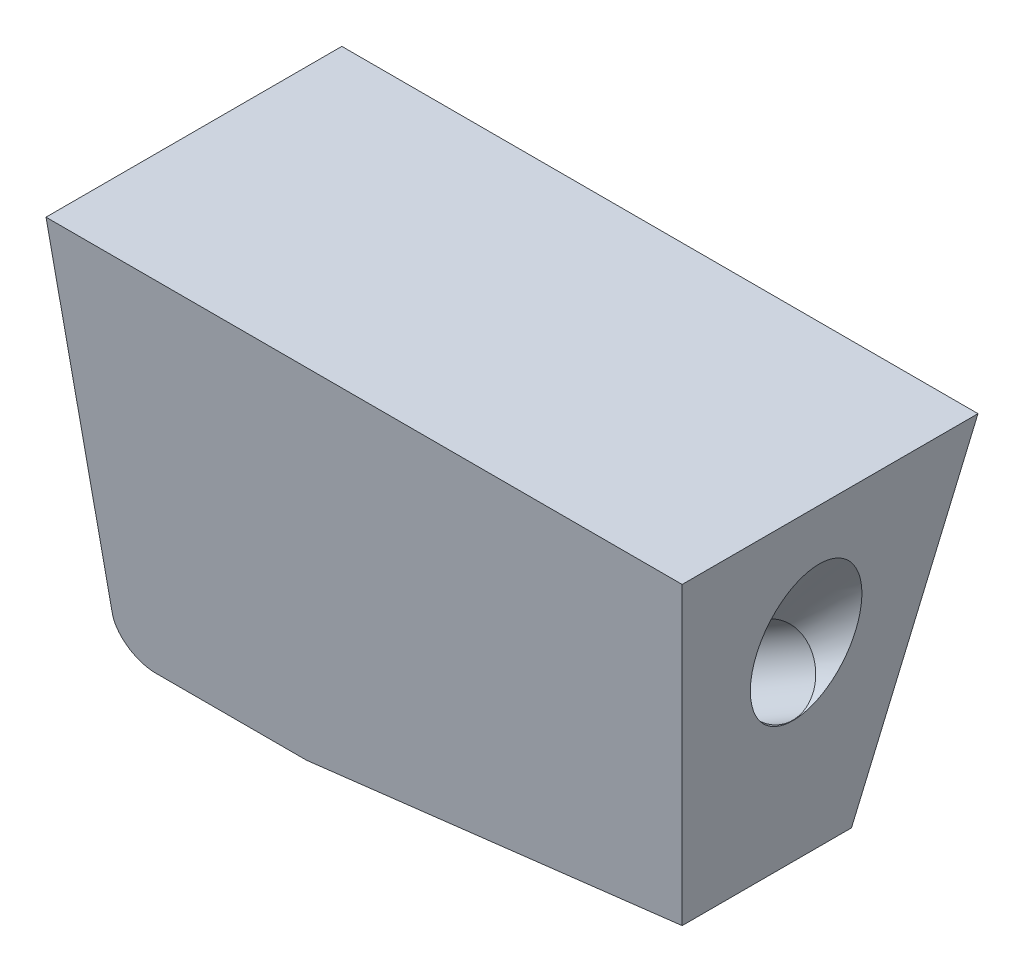
ISO-10303-21;
HEADER;
FILE_DESCRIPTION(('STEP AP214'),'2;1');
FILE_NAME('part.step','',(''),(''),'','','');
FILE_SCHEMA(('AUTOMOTIVE_DESIGN { 1 0 10303 214 1 1 1 1 }'));
ENDSEC;
DATA;
#1=APPLICATION_CONTEXT('core data for automotive mechanical design processes');
#2=APPLICATION_PROTOCOL_DEFINITION('international standard','automotive_design',2000,#1);
#3=PRODUCT_CONTEXT('',#1,'mechanical');
#4=PRODUCT('Part','Part','',(#3));
#5=PRODUCT_RELATED_PRODUCT_CATEGORY('part','',(#4));
#6=PRODUCT_DEFINITION_FORMATION('','',#4);
#7=PRODUCT_DEFINITION_CONTEXT('part definition',#1,'design');
#8=PRODUCT_DEFINITION('design','',#6,#7);
#9=PRODUCT_DEFINITION_SHAPE('','',#8);
#10=(LENGTH_UNIT() NAMED_UNIT(*) SI_UNIT(.MILLI.,.METRE.));
#11=(NAMED_UNIT(*) PLANE_ANGLE_UNIT() SI_UNIT($,.RADIAN.));
#12=(NAMED_UNIT(*) SI_UNIT($,.STERADIAN.) SOLID_ANGLE_UNIT());
#13=UNCERTAINTY_MEASURE_WITH_UNIT(LENGTH_MEASURE(1.E-05),#10,'distance_accuracy_value','');
#14=(GEOMETRIC_REPRESENTATION_CONTEXT(3) GLOBAL_UNCERTAINTY_ASSIGNED_CONTEXT((#13)) GLOBAL_UNIT_ASSIGNED_CONTEXT((#10,
#11,#12)) REPRESENTATION_CONTEXT('',''));
#15=CARTESIAN_POINT('',(0.,0.,0.));
#16=DIRECTION('',(0.,0.,1.));
#17=DIRECTION('',(1.,0.,0.));
#18=AXIS2_PLACEMENT_3D('',#15,#16,#17);
#19=CARTESIAN_POINT('',(38.0505893023531,0.,0.0508));
#20=DIRECTION('',(0.,-0.173648177666931,0.984807753012208));
#21=DIRECTION('',(0.,-0.984807753012208,-0.173648177666931));
#22=AXIS2_PLACEMENT_3D('',#19,#20,#21);
#23=PLANE('',#22);
#24=DIRECTION('',(-0.171087869746036,-0.970287525247814,-0.171087869746036));
#25=VECTOR('',#24,1.);
#26=CARTESIAN_POINT('',(1.11871235410314,6.31572292356323,1.16443235410315));
#27=LINE('',#26,#25);
#28=CARTESIAN_POINT('',(0.0543151661605585,0.279226502732241,0.100035166160561));
#29=VERTEX_POINT('',#28);
#30=CARTESIAN_POINT('',(0.0115343561363211,0.036604472613274,0.0572543561363241));
#31=VERTEX_POINT('',#30);
#32=EDGE_CURVE('E379',#29,#31,#27,.T.);
#33=ORIENTED_EDGE('',*,*,#32,.F.);
#34=DIRECTION('',(-1.,0.,0.));
#35=VECTOR('',#34,1.);
#36=CARTESIAN_POINT('',(38.0505893023531,0.27922650273224,0.10003516616056));
#37=LINE('',#36,#35);
#38=CARTESIAN_POINT('',(-0.37592,0.279226502732242,0.100035166160561));
#39=VERTEX_POINT('',#38);
#40=EDGE_CURVE('E76',#29,#39,#37,.T.);
#41=ORIENTED_EDGE('',*,*,#40,.T.);
#42=DIRECTION('',(0.,0.984807753012208,0.173648177666931));
#43=VECTOR('',#42,1.);
#44=CARTESIAN_POINT('',(-0.37592,28.949469786949,5.15537260064367));
#45=LINE('',#44,#43);
#46=CARTESIAN_POINT('',(-0.37592,0.0231304279169758,0.054878518517096));
#47=VERTEX_POINT('',#46);
#48=EDGE_CURVE('E226',#47,#39,#45,.T.);
#49=ORIENTED_EDGE('',*,*,#48,.F.);
#50=CARTESIAN_POINT('',(-0.3506216,0.0254,0.0552787053099968));
#51=DIRECTION('',(0.,-0.173648177666931,0.984807753012208));
#52=DIRECTION('',(0.,-0.984807753012208,-0.173648177666931));
#53=AXIS2_PLACEMENT_3D('',#50,#51,#52);
#54=ELLIPSE('',#53,0.0257918359418979,0.0254);
#55=CARTESIAN_POINT('',(-0.3506216,0.,0.0508000000000017));
#56=VERTEX_POINT('',#55);
#57=EDGE_CURVE('E408',#56,#47,#54,.F.);
#58=ORIENTED_EDGE('',*,*,#57,.F.);
#59=DIRECTION('',(-1.,0.,0.));
#60=VECTOR('',#59,1.);
#61=CARTESIAN_POINT('',(38.0505893023531,0.,0.0508));
#62=LINE('',#61,#60);
#63=CARTESIAN_POINT('',(-0.24892,0.,0.0508000000000001));
#64=VERTEX_POINT('',#63);
#65=EDGE_CURVE('E372',#64,#56,#62,.T.);
#66=ORIENTED_EDGE('',*,*,#65,.F.);
#67=DIRECTION('',(-0.98997002855162,-0.139131214142995,-0.0245325869121374));
#68=VECTOR('',#67,1.);
#69=CARTESIAN_POINT('',(37.2861562759435,5.27521095043905,0.980962019491154));
#70=LINE('',#69,#68);
#71=EDGE_CURVE('E374',#31,#64,#70,.T.);
#72=ORIENTED_EDGE('',*,*,#71,.F.);
#73=EDGE_LOOP('',(#33,#41,#49,#58,#66,#72));
#74=FACE_BOUND('',#73,.T.);
#75=ADVANCED_FACE('F47',(#74),#23,.T.);
#76=CARTESIAN_POINT('',(38.0505893023531,0.,-0.0508));
#77=DIRECTION('',(0.,-0.173648177666931,-0.984807753012208));
#78=DIRECTION('',(0.,0.984807753012208,-0.173648177666931));
#79=AXIS2_PLACEMENT_3D('',#76,#77,#78);
#80=PLANE('',#79);
#81=DIRECTION('',(0.,-0.984807753012208,0.173648177666931));
#82=VECTOR('',#81,1.);
#83=CARTESIAN_POINT('',(-0.37592,29.2239341047245,-5.20376806510924));
#84=LINE('',#83,#82);
#85=CARTESIAN_POINT('',(-0.37592,0.279226502732242,-0.10003516616056));
#86=VERTEX_POINT('',#85);
#87=CARTESIAN_POINT('',(-0.37592,0.0231304279169793,-0.054878518517096));
#88=VERTEX_POINT('',#87);
#89=EDGE_CURVE('E55',#86,#88,#84,.T.);
#90=ORIENTED_EDGE('',*,*,#89,.F.);
#91=DIRECTION('',(1.,0.,0.));
#92=VECTOR('',#91,1.);
#93=CARTESIAN_POINT('',(38.0505893023531,0.27922650273224,-0.10003516616056));
#94=LINE('',#93,#92);
#95=CARTESIAN_POINT('',(0.0543151661605584,0.279226502732241,-0.100035166160561));
#96=VERTEX_POINT('',#95);
#97=EDGE_CURVE('E172',#86,#96,#94,.T.);
#98=ORIENTED_EDGE('',*,*,#97,.T.);
#99=DIRECTION('',(0.171087869746036,0.970287525247814,-0.171087869746036));
#100=VECTOR('',#99,1.);
#101=CARTESIAN_POINT('',(1.11871235410314,6.31572292356323,-1.16443235410315));
#102=LINE('',#101,#100);
#103=CARTESIAN_POINT('',(0.0115343561363211,0.036604472613274,-0.0572543561363241));
#104=VERTEX_POINT('',#103);
#105=EDGE_CURVE('E161',#104,#96,#102,.T.);
#106=ORIENTED_EDGE('',*,*,#105,.F.);
#107=DIRECTION('',(0.98997002855162,0.139131214142995,-0.0245325869121374));
#108=VECTOR('',#107,1.);
#109=CARTESIAN_POINT('',(37.2861562759435,5.27521095043905,-0.980962019491154));
#110=LINE('',#109,#108);
#111=CARTESIAN_POINT('',(-0.24892,0.,-0.0508000000000001));
#112=VERTEX_POINT('',#111);
#113=EDGE_CURVE('E169',#112,#104,#110,.T.);
#114=ORIENTED_EDGE('',*,*,#113,.F.);
#115=DIRECTION('',(-1.,0.,0.));
#116=VECTOR('',#115,1.);
#117=CARTESIAN_POINT('',(38.0505893023531,0.,-0.0508));
#118=LINE('',#117,#116);
#119=CARTESIAN_POINT('',(-0.3506216,0.,-0.0507999999999948));
#120=VERTEX_POINT('',#119);
#121=EDGE_CURVE('E228',#112,#120,#118,.T.);
#122=ORIENTED_EDGE('',*,*,#121,.T.);
#123=CARTESIAN_POINT('',(-0.3506216,0.0254,-0.0552787053099899));
#124=DIRECTION('',(0.,-0.173648177666931,-0.984807753012208));
#125=DIRECTION('',(0.,0.984807753012208,-0.173648177666931));
#126=AXIS2_PLACEMENT_3D('',#123,#124,#125);
#127=ELLIPSE('',#126,0.0257918359418979,0.0254);
#128=EDGE_CURVE('E367',#88,#120,#127,.F.);
#129=ORIENTED_EDGE('',*,*,#128,.F.);
#130=EDGE_LOOP('',(#90,#98,#106,#114,#122,#129));
#131=FACE_BOUND('',#130,.T.);
#132=ADVANCED_FACE('F173',(#131),#80,.T.);
#133=CARTESIAN_POINT('',(-0.37592,29.999999944,-0.80247998));
#134=DIRECTION('',(-1.,0.,0.));
#135=DIRECTION('',(0.,0.,1.));
#136=AXIS2_PLACEMENT_3D('',#133,#134,#135);
#137=PLANE('',#136);
#138=ORIENTED_EDGE('',*,*,#48,.T.);
#139=DIRECTION('',(0.,0.,-1.));
#140=VECTOR('',#139,1.);
#141=CARTESIAN_POINT('',(-0.37592,0.279226502732242,-0.80247998));
#142=LINE('',#141,#140);
#143=EDGE_CURVE('E68',#39,#86,#142,.T.);
#144=ORIENTED_EDGE('',*,*,#143,.T.);
#145=ORIENTED_EDGE('',*,*,#89,.T.);
#146=DIRECTION('',(0.,0.,-1.));
#147=VECTOR('',#146,1.);
#148=CARTESIAN_POINT('',(-0.37592,0.0231304279169835,37.6580852134618));
#149=LINE('',#148,#147);
#150=CARTESIAN_POINT('',(-0.375957340358209,0.0243423580024402,-0.0205887567390789));
#151=VERTEX_POINT('',#150);
#152=EDGE_CURVE('E186',#151,#88,#149,.T.);
#153=ORIENTED_EDGE('',*,*,#152,.F.);
#154=CARTESIAN_POINT('',(-0.37592,0.,0.0482432865795852));
#155=CARTESIAN_POINT('',(-0.37592,0.0149574693246277,0.0344039161936227));
#156=CARTESIAN_POINT('',(-0.37592,0.0292099999999983,0.0174815349681417));
#157=CARTESIAN_POINT('',(-0.37592,0.0292099999999983,-0.0174815349681413));
#158=CARTESIAN_POINT('',(-0.37592,0.0149574693246281,-0.0344039161936234));
#159=CARTESIAN_POINT('',(-0.37592,0.,-0.0482432865795854));
#160=(BOUNDED_CURVE() B_SPLINE_CURVE(3,(#154,#155,#156,#157,#158,#159),.UNSPECIFIED.,.F.,
.F.) B_SPLINE_CURVE_WITH_KNOTS((4,2,4),(1.41317404265068,1.5707963267949,1.72841861093912),
.UNSPECIFIED.) CURVE() GEOMETRIC_REPRESENTATION_ITEM() RATIONAL_B_SPLINE_CURVE((1.,1.,1.,1.,1.,1.)) REPRESENTATION_ITEM(''));
#161=CARTESIAN_POINT('',(-0.37592,0.023130410152621,0.0207294392733753));
#162=VERTEX_POINT('',#161);
#163=EDGE_CURVE('E340',#151,#162,#160,.F.);
#164=ORIENTED_EDGE('',*,*,#163,.T.);
#165=EDGE_CURVE('E537',#47,#162,#149,.T.);
#166=ORIENTED_EDGE('',*,*,#165,.F.);
#167=EDGE_LOOP('',(#138,#144,#145,#153,#164,#166));
#168=FACE_BOUND('',#167,.T.);
#169=ADVANCED_FACE('F305',(#168),#137,.T.);
#170=CARTESIAN_POINT('',(0.0115343561363241,0.036604472613273,38.4527456938784));
#171=DIRECTION('',(-0.984807753012208,0.173648177666931,0.));
#172=DIRECTION('',(-0.173648177666931,-0.984807753012208,0.));
#173=AXIS2_PLACEMENT_3D('',#170,#171,#172);
#174=PLANE('',#173);
#175=CARTESIAN_POINT('',(0.0380901578677491,0.187209908178076,0.));
#176=DIRECTION('',(-0.984807753012208,0.173648177666931,0.));
#177=DIRECTION('',(0.173648177666931,0.984807753012208,0.));
#178=AXIS2_PLACEMENT_3D('',#175,#176,#177);
#179=ELLIPSE('',#178,0.0510507152050236,0.0366689973897193);
#180=CARTESIAN_POINT('',(0.0469550215316949,0.237485048308801,0.));
#181=VERTEX_POINT('',#180);
#182=EDGE_CURVE('E236',#181,#181,#179,.F.);
#183=ORIENTED_EDGE('',*,*,#182,.F.);
#184=EDGE_LOOP('',(#183));
#185=FACE_BOUND('',#184,.T.);
#186=DIRECTION('',(0.,0.,-1.));
#187=VECTOR('',#186,1.);
#188=CARTESIAN_POINT('',(0.05431516616056,0.27922650273224,38.4527456938784));
#189=LINE('',#188,#187);
#190=EDGE_CURVE('E13',#29,#96,#189,.T.);
#191=ORIENTED_EDGE('',*,*,#190,.F.);
#192=ORIENTED_EDGE('',*,*,#32,.T.);
#193=DIRECTION('',(0.,0.,-1.));
#194=VECTOR('',#193,1.);
#195=CARTESIAN_POINT('',(0.0115343561363241,0.036604472613273,38.4527456938784));
#196=LINE('',#195,#194);
#197=EDGE_CURVE('E165',#31,#104,#196,.T.);
#198=ORIENTED_EDGE('',*,*,#197,.T.);
#199=ORIENTED_EDGE('',*,*,#105,.T.);
#200=EDGE_LOOP('',(#191,#192,#198,#199));
#201=FACE_BOUND('',#200,.T.);
#202=ADVANCED_FACE('F163',(#185,#201),#174,.F.);
#203=CARTESIAN_POINT('',(0.,0.,0.));
#204=DIRECTION('',(0.,1.,0.));
#205=DIRECTION('',(0.,0.,1.));
#206=AXIS2_PLACEMENT_3D('',#203,#204,#205);
#207=PLANE('',#206);
#208=ORIENTED_EDGE('',*,*,#65,.T.);
#209=DIRECTION('',(0.,0.,-1.));
#210=VECTOR('',#209,1.);
#211=CARTESIAN_POINT('',(-0.3506216,0.,37.6580852134618));
#212=LINE('',#211,#210);
#213=CARTESIAN_POINT('',(-0.350621600000003,0.,0.0482432865795852));
#214=VERTEX_POINT('',#213);
#215=EDGE_CURVE('E183',#56,#214,#212,.T.);
#216=ORIENTED_EDGE('',*,*,#215,.T.);
#217=DIRECTION('',(-1.,0.,0.));
#218=VECTOR('',#217,1.);
#219=CARTESIAN_POINT('',(37.8918393023531,0.,0.0482432865795852));
#220=LINE('',#219,#218);
#221=CARTESIAN_POINT('',(-0.247427736840581,0.00020972391001975,0.0469039203635975));
#222=VERTEX_POINT('',#221);
#223=EDGE_CURVE('E394',#222,#214,#220,.T.);
#224=ORIENTED_EDGE('',*,*,#223,.F.);
#225=DIRECTION('',(0.,0.,-1.));
#226=VECTOR('',#225,1.);
#227=CARTESIAN_POINT('',(-0.24892,0.,38.4527456938784));
#228=LINE('',#227,#226);
#229=EDGE_CURVE('E383',#64,#222,#228,.T.);
#230=ORIENTED_EDGE('',*,*,#229,.F.);
#231=EDGE_LOOP('',(#208,#216,#224,#230));
#232=FACE_BOUND('',#231,.T.);
#233=ADVANCED_FACE('F304',(#232),#207,.F.);
#234=DIRECTION('',(-1.,0.,0.));
#235=VECTOR('',#234,1.);
#236=CARTESIAN_POINT('',(37.8918393023531,0.,-0.0482432865795852));
#237=LINE('',#236,#235);
#238=CARTESIAN_POINT('',(-0.247270615874089,0.000231805821799829,-0.04675977376317));
#239=VERTEX_POINT('',#238);
#240=CARTESIAN_POINT('',(-0.350621600000003,0.,-0.0482432865795852));
#241=VERTEX_POINT('',#240);
#242=EDGE_CURVE('E371',#239,#241,#237,.T.);
#243=ORIENTED_EDGE('',*,*,#242,.T.);
#244=EDGE_CURVE('E179',#241,#120,#212,.T.);
#245=ORIENTED_EDGE('',*,*,#244,.T.);
#246=ORIENTED_EDGE('',*,*,#121,.F.);
#247=EDGE_CURVE('E387',#239,#112,#228,.T.);
#248=ORIENTED_EDGE('',*,*,#247,.F.);
#249=EDGE_LOOP('',(#243,#245,#246,#248));
#250=FACE_BOUND('',#249,.T.);
#251=ADVANCED_FACE('F311',(#250),#207,.F.);
#252=CARTESIAN_POINT('',(-0.24892,0.,38.4527456938784));
#253=DIRECTION('',(-0.139173100960066,0.99026806874157,0.));
#254=DIRECTION('',(-0.99026806874157,-0.139173100960066,0.));
#255=AXIS2_PLACEMENT_3D('',#252,#253,#254);
#256=PLANE('',#255);
#257=CARTESIAN_POINT('',(-0.0688351637631521,0.0253092732019702,0.0508));
#258=DIRECTION('',(-0.139173100960066,0.99026806874157,0.));
#259=DIRECTION('',(-0.99026806874157,-0.139173100960066,0.));
#260=AXIS2_PLACEMENT_3D('',#257,#258,#259);
#261=ELLIPSE('',#260,0.182506531971923,0.0254);
#262=CARTESIAN_POINT('',(-0.127,0.0171347385669156,0.0267513621279644));
#263=VERTEX_POINT('',#262);
#264=EDGE_CURVE('E244',#222,#263,#261,.F.);
#265=ORIENTED_EDGE('',*,*,#264,.T.);
#266=DIRECTION('',(0.,0.,1.));
#267=VECTOR('',#266,1.);
#268=CARTESIAN_POINT('',(-0.127,0.0171347385669156,38.4527456938784));
#269=LINE('',#268,#267);
#270=CARTESIAN_POINT('',(-0.127,0.0171347385669156,-0.0267513621279644));
#271=VERTEX_POINT('',#270);
#272=EDGE_CURVE('E235',#271,#263,#269,.T.);
#273=ORIENTED_EDGE('',*,*,#272,.F.);
#274=CARTESIAN_POINT('',(-0.0688351637631521,0.0253092732019702,-0.0508));
#275=DIRECTION('',(-0.139173100960066,0.99026806874157,0.));
#276=DIRECTION('',(-0.99026806874157,-0.139173100960066,0.));
#277=AXIS2_PLACEMENT_3D('',#274,#275,#276);
#278=ELLIPSE('',#277,0.182506531971923,0.0254);
#279=EDGE_CURVE('E241',#271,#239,#278,.F.);
#280=ORIENTED_EDGE('',*,*,#279,.T.);
#281=ORIENTED_EDGE('',*,*,#247,.T.);
#282=ORIENTED_EDGE('',*,*,#113,.T.);
#283=ORIENTED_EDGE('',*,*,#197,.F.);
#284=ORIENTED_EDGE('',*,*,#71,.T.);
#285=ORIENTED_EDGE('',*,*,#229,.T.);
#286=EDGE_LOOP('',(#265,#273,#280,#281,#282,#283,#284,#285));
#287=FACE_BOUND('',#286,.T.);
#288=ADVANCED_FACE('F307',(#287),#256,.F.);
#289=CARTESIAN_POINT('',(-0.127,0.0762000000000001,0.0254));
#290=DIRECTION('',(-1.,0.,0.));
#291=DIRECTION('',(0.,0.,1.));
#292=AXIS2_PLACEMENT_3D('',#289,#290,#291);
#293=PLANE('',#292);
#294=ORIENTED_EDGE('',*,*,#272,.T.);
#295=CARTESIAN_POINT('',(-0.127000000000002,0.0253092732019702,0.0508));
#296=DIRECTION('',(-1.,0.,0.));
#297=DIRECTION('',(0.,0.,1.));
#298=AXIS2_PLACEMENT_3D('',#295,#296,#297);
#299=CIRCLE('',#298,0.0254);
#300=CARTESIAN_POINT('',(-0.127,0.0253092732019702,0.0254));
#301=VERTEX_POINT('',#300);
#302=EDGE_CURVE('E443',#263,#301,#299,.F.);
#303=ORIENTED_EDGE('',*,*,#302,.T.);
#304=DIRECTION('',(0.,1.,0.));
#305=VECTOR('',#304,1.);
#306=CARTESIAN_POINT('',(-0.127,0.0762000000000001,0.0254));
#307=LINE('',#306,#305);
#308=CARTESIAN_POINT('',(-0.127,0.0762000000000001,0.0254));
#309=VERTEX_POINT('',#308);
#310=EDGE_CURVE('E257',#301,#309,#307,.T.);
#311=ORIENTED_EDGE('',*,*,#310,.T.);
#312=CARTESIAN_POINT('',(-0.127,0.0762000000000001,0.));
#313=DIRECTION('',(1.,0.,0.));
#314=DIRECTION('',(0.,1.,0.));
#315=AXIS2_PLACEMENT_3D('',#312,#313,#314);
#316=ELLIPSE('',#315,0.0293293936748329,0.0254);
#317=CARTESIAN_POINT('',(-0.127,0.0762000000000001,-0.0254000000000018));
#318=VERTEX_POINT('',#317);
#319=EDGE_CURVE('E405',#318,#309,#316,.F.);
#320=ORIENTED_EDGE('',*,*,#319,.F.);
#321=DIRECTION('',(0.,1.,0.));
#322=VECTOR('',#321,1.);
#323=CARTESIAN_POINT('',(-0.127,0.0762000000000001,-0.0254));
#324=LINE('',#323,#322);
#325=CARTESIAN_POINT('',(-0.127,0.0253092732019702,-0.0254));
#326=VERTEX_POINT('',#325);
#327=EDGE_CURVE('E262',#326,#318,#324,.T.);
#328=ORIENTED_EDGE('',*,*,#327,.F.);
#329=CARTESIAN_POINT('',(-0.127000000000002,0.0253092732019702,-0.0508));
#330=DIRECTION('',(-1.,0.,0.));
#331=DIRECTION('',(0.,0.,1.));
#332=AXIS2_PLACEMENT_3D('',#329,#330,#331);
#333=CIRCLE('',#332,0.0254);
#334=EDGE_CURVE('E361',#326,#271,#333,.F.);
#335=ORIENTED_EDGE('',*,*,#334,.T.);
#336=EDGE_LOOP('',(#294,#303,#311,#320,#328,#335));
#337=FACE_BOUND('',#336,.T.);
#338=ADVANCED_FACE('F310',(#337),#293,.T.);
#339=CARTESIAN_POINT('',(0.,0.,0.0254));
#340=DIRECTION('',(0.,0.,-1.));
#341=DIRECTION('',(-1.,0.,0.));
#342=AXIS2_PLACEMENT_3D('',#339,#340,#341);
#343=PLANE('',#342);
#344=ORIENTED_EDGE('',*,*,#310,.F.);
#345=DIRECTION('',(1.,0.,0.));
#346=VECTOR('',#345,1.);
#347=CARTESIAN_POINT('',(-0.263296988873618,0.0253092732019702,0.0254));
#348=LINE('',#347,#346);
#349=CARTESIAN_POINT('',(-0.246303848956329,0.0253092732019704,0.0254));
#350=VERTEX_POINT('',#349);
#351=EDGE_CURVE('E249',#301,#350,#348,.F.);
#352=ORIENTED_EDGE('',*,*,#351,.T.);
#353=DIRECTION('',(-0.601815023152052,-0.79863551004729,0.));
#354=VECTOR('',#353,1.);
#355=CARTESIAN_POINT('',(-0.169261612745645,0.127547773811413,0.0254));
#356=LINE('',#355,#354);
#357=CARTESIAN_POINT('',(-0.207954935664998,0.0762000000000001,0.0254));
#358=VERTEX_POINT('',#357);
#359=EDGE_CURVE('E252',#358,#350,#356,.T.);
#360=ORIENTED_EDGE('',*,*,#359,.F.);
#361=DIRECTION('',(-1.,0.,0.));
#362=VECTOR('',#361,1.);
#363=CARTESIAN_POINT('',(-0.239759181382167,0.0762000000000001,0.0254));
#364=LINE('',#363,#362);
#365=EDGE_CURVE('E414',#309,#358,#364,.T.);
#366=ORIENTED_EDGE('',*,*,#365,.F.);
#367=EDGE_LOOP('',(#344,#352,#360,#366));
#368=FACE_BOUND('',#367,.T.);
#369=ADVANCED_FACE('F437',(#368),#343,.T.);
#370=CARTESIAN_POINT('',(0.,0.,-0.0254));
#371=DIRECTION('',(0.,0.,-1.));
#372=DIRECTION('',(-1.,0.,0.));
#373=AXIS2_PLACEMENT_3D('',#370,#371,#372);
#374=PLANE('',#373);
#375=DIRECTION('',(0.601815023152052,0.79863551004729,0.));
#376=VECTOR('',#375,1.);
#377=CARTESIAN_POINT('',(-0.207954935664998,0.0762000000000001,-0.0254));
#378=LINE('',#377,#376);
#379=CARTESIAN_POINT('',(-0.246303848956372,0.025309273201913,-0.0254));
#380=VERTEX_POINT('',#379);
#381=CARTESIAN_POINT('',(-0.207954935664998,0.0762000000000001,-0.0254));
#382=VERTEX_POINT('',#381);
#383=EDGE_CURVE('E256',#380,#382,#378,.T.);
#384=ORIENTED_EDGE('',*,*,#383,.F.);
#385=DIRECTION('',(-1.,0.,0.));
#386=VECTOR('',#385,1.);
#387=CARTESIAN_POINT('',(0.,0.0253092732019702,-0.0254));
#388=LINE('',#387,#386);
#389=EDGE_CURVE('E270',#380,#326,#388,.F.);
#390=ORIENTED_EDGE('',*,*,#389,.T.);
#391=ORIENTED_EDGE('',*,*,#327,.T.);
#392=DIRECTION('',(-1.,0.,0.));
#393=VECTOR('',#392,1.);
#394=CARTESIAN_POINT('',(-0.239759181382167,0.0762000000000001,-0.0254));
#395=LINE('',#394,#393);
#396=EDGE_CURVE('E413',#318,#382,#395,.T.);
#397=ORIENTED_EDGE('',*,*,#396,.T.);
#398=EDGE_LOOP('',(#384,#390,#391,#397));
#399=FACE_BOUND('',#398,.T.);
#400=ADVANCED_FACE('F422',(#399),#374,.F.);
#401=CARTESIAN_POINT('',(0.0162278865229575,0.15889265883949,0.));
#402=DIRECTION('',(0.866025403784441,0.499999999999995,0.));
#403=DIRECTION('',(-0.499999999999995,0.866025403784441,0.));
#404=AXIS2_PLACEMENT_3D('',#401,#402,#403);
#405=CONICAL_SURFACE('',#404,0.0254,0.392699081698725);
#406=CARTESIAN_POINT('',(0.0162278865229575,0.15889265883949,0.));
#407=DIRECTION('',(0.866025403784441,0.499999999999995,0.));
#408=DIRECTION('',(-0.499999999999995,0.866025403784441,0.));
#409=AXIS2_PLACEMENT_3D('',#406,#407,#408);
#410=CIRCLE('',#409,0.0254);
#411=CARTESIAN_POINT('',(0.00352788652295767,0.180889704095615,0.));
#412=VERTEX_POINT('',#411);
#413=EDGE_CURVE('E398',#412,#412,#410,.T.);
#414=ORIENTED_EDGE('',*,*,#413,.F.);
#415=EDGE_LOOP('',(#414));
#416=FACE_BOUND('',#415,.T.);
#417=ORIENTED_EDGE('',*,*,#182,.T.);
#418=EDGE_LOOP('',(#417));
#419=FACE_BOUND('',#418,.T.);
#420=ADVANCED_FACE('F300',(#416,#419),#405,.F.);
#421=CARTESIAN_POINT('',(-0.207954935664998,0.0762000000000001,0.));
#422=DIRECTION('',(-0.601815023152052,-0.79863551004729,0.));
#423=DIRECTION('',(0.79863551004729,-0.601815023152052,0.));
#424=AXIS2_PLACEMENT_3D('',#421,#422,#423);
#425=CYLINDRICAL_SURFACE('',#424,0.0254);
#426=ORIENTED_EDGE('',*,*,#359,.T.);
#427=CARTESIAN_POINT('',(-0.24630384895641,0.0253092732019416,-0.0254));
#428=CARTESIAN_POINT('',(-0.256880589056377,0.0215777887399168,-0.0253999999999884));
#429=CARTESIAN_POINT('',(-0.266205033658379,0.0188246290504137,-0.0233087426625483));
#430=CARTESIAN_POINT('',(-0.281252520100771,0.0149661762559192,-0.0147233762523557));
#431=CARTESIAN_POINT('',(-0.286704908501805,0.0139204162302094,-0.00759643650025949));
#432=CARTESIAN_POINT('',(-0.286670182425578,0.0139273984737815,0.0076747145990096));
#433=CARTESIAN_POINT('',(-0.281166110494625,0.0149879323785234,0.0147743224417529));
#434=CARTESIAN_POINT('',(-0.266281560771845,0.0188054075108201,0.0232634337113769));
#435=CARTESIAN_POINT('',(-0.256996097570055,0.0215368713990887,0.0254000000000001));
#436=CARTESIAN_POINT('',(-0.246303848956328,0.0253092732019703,0.0254));
#437=(BOUNDED_CURVE() B_SPLINE_CURVE(3,(#427,#428,#429,#430,#431,#432,#433,#434,#435,#436),
.UNSPECIFIED.,.F.,.F.) B_SPLINE_CURVE_WITH_KNOTS((4,2,2,2,4),(-1.02827847248186E-05,
1.69323087716626E-05,4.41474022681438E-05,7.1362495764625E-05,9.85775892611063E-05),
.UNSPECIFIED.) CURVE() GEOMETRIC_REPRESENTATION_ITEM() RATIONAL_B_SPLINE_CURVE((1.,1.,1.,1.,1.,
1.,1.,1.,1.,1.)) REPRESENTATION_ITEM(''));
#438=EDGE_CURVE('E272',#350,#380,#437,.F.);
#439=ORIENTED_EDGE('',*,*,#438,.T.);
#440=ORIENTED_EDGE('',*,*,#383,.T.);
#441=CARTESIAN_POINT('',(-0.207954935664998,0.0762000000000001,0.));
#442=DIRECTION('',(0.,-1.,0.));
#443=DIRECTION('',(-1.,0.,0.));
#444=AXIS2_PLACEMENT_3D('',#441,#442,#443);
#445=ELLIPSE('',#444,0.0318042457171683,0.0254);
#446=EDGE_CURVE('E239',#382,#358,#445,.F.);
#447=ORIENTED_EDGE('',*,*,#446,.T.);
#448=EDGE_LOOP('',(#426,#439,#440,#447));
#449=FACE_BOUND('',#448,.T.);
#450=ADVANCED_FACE('F286',(#449),#425,.F.);
#451=CARTESIAN_POINT('',(-0.239759181382167,0.0762000000000001,0.0254));
#452=DIRECTION('',(0.,-1.,0.));
#453=DIRECTION('',(1.,0.,0.));
#454=AXIS2_PLACEMENT_3D('',#451,#452,#453);
#455=PLANE('',#454);
#456=ORIENTED_EDGE('',*,*,#396,.F.);
#457=CARTESIAN_POINT('',(-0.127,0.0762000000000001,0.));
#458=DIRECTION('',(0.,1.,0.));
#459=DIRECTION('',(1.,0.,0.));
#460=AXIS2_PLACEMENT_3D('',#457,#458,#459);
#461=ELLIPSE('',#460,0.0508000000000005,0.0254);
#462=EDGE_CURVE('E400',#309,#318,#461,.F.);
#463=ORIENTED_EDGE('',*,*,#462,.F.);
#464=ORIENTED_EDGE('',*,*,#365,.T.);
#465=ORIENTED_EDGE('',*,*,#446,.F.);
#466=EDGE_LOOP('',(#456,#463,#464,#465));
#467=FACE_BOUND('',#466,.T.);
#468=ADVANCED_FACE('F299',(#467),#455,.T.);
#469=CARTESIAN_POINT('',(-0.35230783073679,-0.0538815367264147,0.));
#470=DIRECTION('',(0.866025403784441,0.499999999999995,0.));
#471=DIRECTION('',(-0.499999999999995,0.866025403784441,0.));
#472=AXIS2_PLACEMENT_3D('',#469,#470,#471);
#473=CYLINDRICAL_SURFACE('',#472,0.0254);
#474=ORIENTED_EDGE('',*,*,#319,.T.);
#475=ORIENTED_EDGE('',*,*,#462,.T.);
#476=EDGE_LOOP('',(#474,#475));
#477=FACE_BOUND('',#476,.T.);
#478=ORIENTED_EDGE('',*,*,#413,.T.);
#479=EDGE_LOOP('',(#478));
#480=FACE_BOUND('',#479,.T.);
#481=ADVANCED_FACE('F431',(#477,#480),#473,.F.);
#482=CARTESIAN_POINT('',(37.8918393023531,-0.30353,0.));
#483=DIRECTION('',(-1.,0.,0.));
#484=DIRECTION('',(0.,0.,1.));
#485=AXIS2_PLACEMENT_3D('',#482,#483,#484);
#486=CYLINDRICAL_SURFACE('',#485,0.30734);
#487=ORIENTED_EDGE('',*,*,#223,.T.);
#488=CARTESIAN_POINT('',(-0.3506216,0.,0.0482432865795852));
#489=CARTESIAN_POINT('',(-0.350869513301096,-1.19542843804009E-07,0.0482439866555445));
#490=CARTESIAN_POINT('',(-0.351116461392933,3.62470794981249E-06,0.0482204837583814));
#491=CARTESIAN_POINT('',(-0.351599424475882,1.77257610530417E-05,0.0481316635507894));
#492=CARTESIAN_POINT('',(-0.351835538449228,2.79980345508001E-05,0.0480668807295803));
#493=CARTESIAN_POINT('',(-0.352357926088675,5.77005969757849E-05,0.0478789541586126));
#494=CARTESIAN_POINT('',(-0.352639994385228,7.88787351781822E-05,0.0477446199469163));
#495=CARTESIAN_POINT('',(-0.353179895346921,0.00012770355898588,0.0474331108524058));
#496=CARTESIAN_POINT('',(-0.353437584553503,0.000155385552449475,0.0472557019452807));
#497=CARTESIAN_POINT('',(-0.35410334233734,0.000236174594357484,0.0467343071530915));
#498=CARTESIAN_POINT('',(-0.354488089991853,0.000293366747035679,0.0463615583951805));
#499=CARTESIAN_POINT('',(-0.355200551579075,0.00041357468016488,0.0455669319559013));
#500=CARTESIAN_POINT('',(-0.355528137167256,0.000476603091413778,0.0451449471799644));
#501=CARTESIAN_POINT('',(-0.356713686855196,0.000724574718518688,0.0434579803018298));
#502=CARTESIAN_POINT('',(-0.357419941338527,0.000917424822641933,0.0420900984298455));
#503=CARTESIAN_POINT('',(-0.358648099103955,0.00129385703696113,0.0392733364497401));
#504=CARTESIAN_POINT('',(-0.359168731306756,0.00147736813627217,0.0378239736931041));
#505=CARTESIAN_POINT('',(-0.361184563556255,0.00223677886764474,0.0314441024489441));
#506=CARTESIAN_POINT('',(-0.362100091462294,0.00272303861932326,0.0263250556700763));
#507=CARTESIAN_POINT('',(-0.363389066260708,0.00343648568054064,0.0160225561821316));
#508=CARTESIAN_POINT('',(-0.363761178270333,0.00366303472730802,0.0108389763129099));
#509=CARTESIAN_POINT('',(-0.364074585043324,0.00385330138614364,0.000449493392475093));
#510=CARTESIAN_POINT('',(-0.364015953724792,0.00381706409391517,-0.00475640567539543));
#511=CARTESIAN_POINT('',(-0.363461245903479,0.00348101396992537,-0.0151346555748506));
#512=CARTESIAN_POINT('',(-0.362965506204434,0.00318140407436113,-0.0203070291482755));
#513=CARTESIAN_POINT('',(-0.361689463461915,0.00253284401461769,-0.0281196828661196));
#514=CARTESIAN_POINT('',(-0.361153770464877,0.00227386598671883,-0.030803247205738));
#515=CARTESIAN_POINT('',(-0.35998147453684,0.00178202258087833,-0.0352985409759518));
#516=CARTESIAN_POINT('',(-0.359421812463212,0.00156415994286806,-0.0371329765625618));
#517=CARTESIAN_POINT('',(-0.358017049615104,0.00108653420359591,-0.0408693960879412));
#518=CARTESIAN_POINT('',(-0.3571535058511,0.000824845821217888,-0.0427659366927635));
#519=CARTESIAN_POINT('',(-0.355768555135483,0.000526022910364456,-0.0448100132221543));
#520=CARTESIAN_POINT('',(-0.35552873938742,0.000477218188454376,-0.0451397061499084));
#521=CARTESIAN_POINT('',(-0.355018245564512,0.000382020953426328,-0.0457761949331113));
#522=CARTESIAN_POINT('',(-0.354747504201856,0.000335633680386465,-0.0460829416292269));
#523=CARTESIAN_POINT('',(-0.354165889185954,0.000246758191854285,-0.0466652445212219));
#524=CARTESIAN_POINT('',(-0.353854542125984,0.000204328109509262,-0.0469403464238036));
#525=CARTESIAN_POINT('',(-0.353188080397483,0.000127793869631248,-0.0474329155161105));
#526=CARTESIAN_POINT('',(-0.352833161443899,9.36543940562991E-05,-0.0476506275388419));
#527=CARTESIAN_POINT('',(-0.352234578988964,5.02841505679239E-05,-0.0479259603811105));
#528=CARTESIAN_POINT('',(-0.35200471251265,3.65754200289801E-05,-0.0480126464944019));
#529=CARTESIAN_POINT('',(-0.35153383492271,1.53075235908815E-05,-0.0481469291864185));
#530=CARTESIAN_POINT('',(-0.351292858260108,7.73054276231096E-06,-0.0481946390090933));
#531=CARTESIAN_POINT('',(-0.350907492270729,1.19685939595464E-06,-0.0482357533750442));
#532=CARTESIAN_POINT('',(-0.350764556582406,-3.31045745510936E-08,-0.04824348277755));
#533=CARTESIAN_POINT('',(-0.3506216,0.,-0.0482432865795856));
#534=B_SPLINE_CURVE_WITH_KNOTS('',3,(#488,#489,#490,#491,#492,#493,#494,#495,#496,#497,#498,
#499,#500,#501,#502,#503,#504,#505,#506,#507,#508,#509,#510,#511,#512,#513,#514,#515,#516,#517,
#518,#519,#520,#521,#522,#523,#524,#525,#526,#527,#528,#529,#530,#531,#532,#533),.UNSPECIFIED.,
.F.,.F.,(4,2,2,2,2,2,2,2,2,2,2,2,2,2,2,2,2,2,2,2,2,2,4),(0.,0.000741043318305404,
0.00147268140779393,0.00240682725086796,0.00334616655924904,0.00495326023235404,
0.00656391709747181,0.0111818210055963,0.0158307654682344,0.0313880221471794,0.0469834307890112,
0.0625761632290314,0.0781568915394389,0.086386554297917,0.0921775559520853,0.0984081610414802,
0.0996385359491783,0.100871475463074,0.102120347956774,0.103363803055067,0.104099176293443,
0.104832405260386,0.105261095012052),.UNSPECIFIED.);
#535=CARTESIAN_POINT('',(-0.361473394081315,0.00244034558475699,0.0289791439237295));
#536=VERTEX_POINT('',#535);
#537=EDGE_CURVE('E360',#214,#536,#534,.T.);
#538=ORIENTED_EDGE('',*,*,#537,.T.);
#539=CARTESIAN_POINT('',(-0.37592,0.,-0.0482432865795854));
#540=CARTESIAN_POINT('',(-0.363217772431818,0.00253447256158176,-0.032297265668513));
#541=CARTESIAN_POINT('',(-0.35052,0.00380999999999999,-0.0161478491107738));
#542=CARTESIAN_POINT('',(-0.35052,0.00380999999999997,0.0161478491107741));
#543=CARTESIAN_POINT('',(-0.36321777243168,0.00253447256156472,0.0322972656686202));
#544=CARTESIAN_POINT('',(-0.37592,0.,0.0482432865795852));
#545=(BOUNDED_CURVE() B_SPLINE_CURVE(3,(#539,#540,#541,#542,#543,#544),.UNSPECIFIED.,.F.,
.F.) B_SPLINE_CURVE_WITH_KNOTS((4,2,4),(1.41317404265068,1.5707963267949,1.72841861093912),
.UNSPECIFIED.) CURVE() GEOMETRIC_REPRESENTATION_ITEM() RATIONAL_B_SPLINE_CURVE((1.,1.,1.,1.,1.,1.)) REPRESENTATION_ITEM(''));
#546=CARTESIAN_POINT('',(-0.361473344830476,0.00244034240288254,-0.0289791775608262));
#547=VERTEX_POINT('',#546);
#548=EDGE_CURVE('E354',#536,#547,#545,.F.);
#549=ORIENTED_EDGE('',*,*,#548,.T.);
#550=EDGE_CURVE('E184',#547,#241,#534,.T.);
#551=ORIENTED_EDGE('',*,*,#550,.T.);
#552=ORIENTED_EDGE('',*,*,#242,.F.);
#553=CARTESIAN_POINT('',(-0.246303848956325,0.000207038606399961,0.0469221374045801));
#554=CARTESIAN_POINT('',(-0.261994559813918,0.000207316689627614,0.046920337312314));
#555=CARTESIAN_POINT('',(-0.275898349894581,0.000892821151031698,0.0429759214354778));
#556=CARTESIAN_POINT('',(-0.298440567397821,0.00269755302137293,0.0272922998540405));
#557=CARTESIAN_POINT('',(-0.306946101984125,0.00380667315349093,0.0141777170419769));
#558=CARTESIAN_POINT('',(-0.306999624688199,0.0038133098370851,-0.0140331116992476));
#559=CARTESIAN_POINT('',(-0.298571223744399,0.0027083067124146,-0.0271976559184589));
#560=CARTESIAN_POINT('',(-0.275782661080328,0.000883265701008408,-0.0430601515416677));
#561=CARTESIAN_POINT('',(-0.261824235351859,0.000207520459406316,-0.0469190182669433));
#562=CARTESIAN_POINT('',(-0.24630384895645,0.000207038606399917,-0.0469221374045802));
#563=(BOUNDED_CURVE() B_SPLINE_CURVE(3,(#553,#554,#555,#556,#557,#558,#559,#560,#561,#562),
.UNSPECIFIED.,.F.,.F.) B_SPLINE_CURVE_WITH_KNOTS((4,2,2,2,4),(-1.02827847248186E-05,
1.69323087716626E-05,4.41474022681438E-05,7.1362495764625E-05,9.85775892611063E-05),
.UNSPECIFIED.) CURVE() GEOMETRIC_REPRESENTATION_ITEM() RATIONAL_B_SPLINE_CURVE((1.,1.,1.,1.,1.,
1.,1.,1.,1.,1.)) REPRESENTATION_ITEM(''));
#564=EDGE_CURVE('E456',#239,#222,#563,.F.);
#565=ORIENTED_EDGE('',*,*,#564,.T.);
#566=EDGE_LOOP('',(#487,#538,#549,#551,#552,#565));
#567=FACE_BOUND('',#566,.T.);
#568=ADVANCED_FACE('F197',(#567),#486,.F.);
#569=CARTESIAN_POINT('',(37.8918393023531,0.0253092732019702,-0.0508));
#570=DIRECTION('',(-1.,0.,0.));
#571=DIRECTION('',(0.,0.,1.));
#572=AXIS2_PLACEMENT_3D('',#569,#570,#571);
#573=CYLINDRICAL_SURFACE('',#572,0.0254);
#574=ORIENTED_EDGE('',*,*,#334,.F.);
#575=ORIENTED_EDGE('',*,*,#389,.F.);
#576=CARTESIAN_POINT('',(-0.24630384895645,0.000207038606399917,-0.0469221374045802));
#577=CARTESIAN_POINT('',(-0.246303848956417,0.00353183789057761,-0.0254000000000245));
#578=CARTESIAN_POINT('',(-0.24630384895641,0.0253092732019416,-0.0254));
#579=(BOUNDED_CURVE() B_SPLINE_CURVE(2,(#576,#577,#578),.UNSPECIFIED.,.F.,
.F.) B_SPLINE_CURVE_WITH_KNOTS((3,3),(0.,1.),
.UNSPECIFIED.) CURVE() GEOMETRIC_REPRESENTATION_ITEM() RATIONAL_B_SPLINE_CURVE((1.,
0.75916788516319,1.)) REPRESENTATION_ITEM(''));
#580=EDGE_CURVE('E396',#239,#380,#579,.T.);
#581=ORIENTED_EDGE('',*,*,#580,.F.);
#582=ORIENTED_EDGE('',*,*,#279,.F.);
#583=EDGE_LOOP('',(#574,#575,#581,#582));
#584=FACE_BOUND('',#583,.T.);
#585=ADVANCED_FACE('F475',(#584),#573,.T.);
#586=CARTESIAN_POINT('',(-0.246303848956328,0.0253092732019703,0.0254));
#587=CARTESIAN_POINT('',(-0.256996097570055,0.0215368713990887,0.0254000000000001));
#588=CARTESIAN_POINT('',(-0.266281560771845,0.0188054075108201,0.0232634337113769));
#589=CARTESIAN_POINT('',(-0.281166110494625,0.0149879323785234,0.0147743224417529));
#590=CARTESIAN_POINT('',(-0.286670182425578,0.0139273984737815,0.0076747145990096));
#591=CARTESIAN_POINT('',(-0.286704908501805,0.0139204162302094,-0.00759643650025949));
#592=CARTESIAN_POINT('',(-0.281252520100771,0.0149661762559192,-0.0147233762523557));
#593=CARTESIAN_POINT('',(-0.266205033658379,0.0188246290504137,-0.0233087426625483));
#594=CARTESIAN_POINT('',(-0.256880589056377,0.0215777887399168,-0.0253999999999884));
#595=CARTESIAN_POINT('',(-0.24630384895641,0.0253092732019416,-0.0254));
#596=CARTESIAN_POINT('',(-0.246303848956326,0.00353183789058149,0.0253999999999999));
#597=CARTESIAN_POINT('',(-0.257027027976962,0.00305993616639256,0.028451842365998));
#598=CARTESIAN_POINT('',(-0.268704684478298,0.00295789889592163,0.0277911322657757));
#599=CARTESIAN_POINT('',(-0.287018897562038,0.00335862994020933,0.0189238356877761));
#600=CARTESIAN_POINT('',(-0.294286870258187,0.00380871619918397,0.00982653280736383));
#601=CARTESIAN_POINT('',(-0.294330932986207,0.00381127711649286,-0.00972542748759154));
#602=CARTESIAN_POINT('',(-0.287120160949806,0.00336100732918874,-0.0188719982995787));
#603=CARTESIAN_POINT('',(-0.268605330227457,0.00295555502127697,-0.0278421938233801));
#604=CARTESIAN_POINT('',(-0.256912595086651,0.00306508855085454,-0.0284179676756457));
#605=CARTESIAN_POINT('',(-0.246303848956417,0.00353183789057761,-0.0254000000000245));
#606=CARTESIAN_POINT('',(-0.246303848956325,0.000207038606399961,0.0469221374045801));
#607=CARTESIAN_POINT('',(-0.261994559813918,0.000207316689627614,0.046920337312314));
#608=CARTESIAN_POINT('',(-0.275898349894581,0.000892821151031698,0.0429759214354778));
#609=CARTESIAN_POINT('',(-0.298440567397821,0.00269755302137293,0.0272922998540405));
#610=CARTESIAN_POINT('',(-0.306946101984125,0.00380667315349093,0.0141777170419769));
#611=CARTESIAN_POINT('',(-0.306999624688199,0.0038133098370851,-0.0140331116992476));
#612=CARTESIAN_POINT('',(-0.298571223744399,0.0027083067124146,-0.0271976559184589));
#613=CARTESIAN_POINT('',(-0.275782661080328,0.000883265701008408,-0.0430601515416677));
#614=CARTESIAN_POINT('',(-0.261824235351859,0.000207520459406316,-0.0469190182669433));
#615=CARTESIAN_POINT('',(-0.24630384895645,0.000207038606399917,-0.0469221374045802));
#616=(BOUNDED_SURFACE() B_SPLINE_SURFACE(2,3,((#586,#587,#588,#589,#590,#591,#592,#593,#594,
#595),(#596,#597,#598,#599,#600,#601,#602,#603,#604,#605),(#606,#607,#608,#609,#610,#611,#612,
#613,#614,#615)),.UNSPECIFIED.,.F.,.F.,.F.) B_SPLINE_SURFACE_WITH_KNOTS((3,3),(4,2,2,2,4),(0.,
1.),(-1.02827847248186E-05,1.69323087716626E-05,4.41474022681438E-05,7.1362495764625E-05,
9.85775892611063E-05),
.UNSPECIFIED.) GEOMETRIC_REPRESENTATION_ITEM() RATIONAL_B_SPLINE_SURFACE(((1.,1.,1.,1.,1.,1.,1.,
1.,1.,1.),(0.759167885162823,0.807314757947619,0.838752966427937,0.8828046097688,
0.894894055530568,0.894974461723094,0.883057182770404,0.838529636467061,0.806816430950191,
0.75916788516319),(1.,1.,1.,1.,1.,1.,1.,1.,1.,1.))) REPRESENTATION_ITEM('') SURFACE());
#617=CARTESIAN_POINT('',(-0.246303848956328,0.0253092732019703,0.0254));
#618=CARTESIAN_POINT('',(-0.246303848956326,0.00353183789058149,0.0253999999999999));
#619=CARTESIAN_POINT('',(-0.246303848956325,0.000207038606399961,0.0469221374045801));
#620=(BOUNDED_CURVE() B_SPLINE_CURVE(2,(#617,#618,#619),.UNSPECIFIED.,.F.,
.F.) B_SPLINE_CURVE_WITH_KNOTS((3,3),(0.,1.),
.UNSPECIFIED.) CURVE() GEOMETRIC_REPRESENTATION_ITEM() RATIONAL_B_SPLINE_CURVE((1.,
0.759167885162823,1.)) REPRESENTATION_ITEM(''));
#621=EDGE_CURVE('E444',#222,#350,#620,.F.);
#622=ORIENTED_EDGE('',*,*,#580,.T.);
#623=ORIENTED_EDGE('',*,*,#438,.F.);
#624=ORIENTED_EDGE('',*,*,#621,.F.);
#625=ORIENTED_EDGE('',*,*,#564,.F.);
#626=EDGE_LOOP('',(#622,#623,#624,#625));
#627=FACE_BOUND('',#626,.T.);
#628=ADVANCED_FACE('F453',(#627),#616,.T.);
#629=CARTESIAN_POINT('',(37.8918393023531,0.0253092732019702,0.0508));
#630=DIRECTION('',(-1.,0.,0.));
#631=DIRECTION('',(0.,0.,1.));
#632=AXIS2_PLACEMENT_3D('',#629,#630,#631);
#633=CYLINDRICAL_SURFACE('',#632,0.0254);
#634=ORIENTED_EDGE('',*,*,#621,.T.);
#635=ORIENTED_EDGE('',*,*,#351,.F.);
#636=ORIENTED_EDGE('',*,*,#302,.F.);
#637=ORIENTED_EDGE('',*,*,#264,.F.);
#638=EDGE_LOOP('',(#634,#635,#636,#637));
#639=FACE_BOUND('',#638,.T.);
#640=ADVANCED_FACE('F441',(#639),#633,.T.);
#641=CARTESIAN_POINT('',(-0.37592,0.,0.0482432865795852));
#642=CARTESIAN_POINT('',(-0.36321777243168,0.00253447256156472,0.0322972656686202));
#643=CARTESIAN_POINT('',(-0.35052,0.00380999999999997,0.0161478491107741));
#644=CARTESIAN_POINT('',(-0.35052,0.00380999999999999,-0.0161478491107738));
#645=CARTESIAN_POINT('',(-0.363217772431818,0.00253447256158176,-0.032297265668513));
#646=CARTESIAN_POINT('',(-0.37592,0.,-0.0482432865795854));
#647=CARTESIAN_POINT('',(-0.37592,0.,0.0482432865795852));
#648=CARTESIAN_POINT('',(-0.375920000000003,0.00253474750405598,0.0322955349393328));
#649=CARTESIAN_POINT('',(-0.375919999999998,0.00381000000000022,0.0161478491107741));
#650=CARTESIAN_POINT('',(-0.375919999999998,0.00381000000000006,-0.0161478491107737));
#651=CARTESIAN_POINT('',(-0.375920000000006,0.00253474750427336,-0.0322955349393677));
#652=CARTESIAN_POINT('',(-0.37592,0.,-0.0482432865795854));
#653=CARTESIAN_POINT('',(-0.37592,0.,0.0482432865795852));
#654=CARTESIAN_POINT('',(-0.37592,0.0149574693246277,0.0344039161936227));
#655=CARTESIAN_POINT('',(-0.37592,0.0292099999999983,0.0174815349681417));
#656=CARTESIAN_POINT('',(-0.37592,0.0292099999999983,-0.0174815349681413));
#657=CARTESIAN_POINT('',(-0.37592,0.0149574693246281,-0.0344039161936234));
#658=CARTESIAN_POINT('',(-0.37592,0.,-0.0482432865795854));
#659=(BOUNDED_SURFACE() B_SPLINE_SURFACE(2,3,((#641,#642,#643,#644,#645,#646),(#647,#648,#649,
#650,#651,#652),(#653,#654,#655,#656,#657,#658)),.UNSPECIFIED.,.F.,.F.,
.F.) B_SPLINE_SURFACE_WITH_KNOTS((3,3),(4,2,4),(0.,1.),(1.41317404265068,1.5707963267949,
1.72841861093912),.UNSPECIFIED.) GEOMETRIC_REPRESENTATION_ITEM() RATIONAL_B_SPLINE_SURFACE(((1.,
1.,1.,1.,1.,1.),(0.707106781186548,0.707106781186548,0.707106781186574,0.707106781186574,
0.707106781186548,0.707106781186548),(1.,1.,1.,1.,1.,1.))) REPRESENTATION_ITEM('') SURFACE());
#660=CARTESIAN_POINT('',(-0.375920000000226,0.0231304279220409,0.0207369913452697));
#661=CARTESIAN_POINT('',(-0.375919151343389,0.023130907481462,0.0204424018984258));
#662=CARTESIAN_POINT('',(-0.375917928144643,0.0231095868649101,0.0201257861957952));
#663=CARTESIAN_POINT('',(-0.375906366572037,0.0229797335931454,0.019542693368834));
#664=CARTESIAN_POINT('',(-0.375896791460149,0.0228785696232188,0.0192742354711985));
#665=CARTESIAN_POINT('',(-0.375865190131629,0.0225833253262293,0.0188451836965246));
#666=CARTESIAN_POINT('',(-0.375845176499962,0.0224048918771392,0.0186745823612112));
#667=CARTESIAN_POINT('',(-0.375794296142039,0.0220032594546594,0.0184067917834131));
#668=CARTESIAN_POINT('',(-0.375763323556778,0.0217796333126729,0.0183103487948187));
#669=CARTESIAN_POINT('',(-0.375677867721712,0.0212221545384239,0.0181293500400792));
#670=CARTESIAN_POINT('',(-0.3756190137568,0.0208825610465335,0.0180680917053442));
#671=CARTESIAN_POINT('',(-0.375485952686643,0.0201991930017983,0.0179881884191293));
#672=CARTESIAN_POINT('',(-0.375411580591222,0.0198554143219369,0.0179700297309166));
#673=CARTESIAN_POINT('',(-0.375079662543532,0.0184628914955129,0.0179408155606567));
#674=CARTESIAN_POINT('',(-0.374761455744681,0.0174269587244255,0.0180221610253987));
#675=CARTESIAN_POINT('',(-0.373999877300916,0.0154101014178997,0.0182570815879018));
#676=CARTESIAN_POINT('',(-0.373555859969537,0.0144294927914353,0.0184110320916656));
#677=CARTESIAN_POINT('',(-0.372002832800251,0.0115092834382539,0.0189857639570033));
#678=CARTESIAN_POINT('',(-0.370696190261689,0.00968816596247907,0.0195145567306289));
#679=CARTESIAN_POINT('',(-0.3680558864348,0.0068491647093198,0.0208468743636156));
#680=CARTESIAN_POINT('',(-0.366780487204098,0.00574340057513148,0.021573777594161));
#681=CARTESIAN_POINT('',(-0.364712721337527,0.00424207628174078,0.0232612310224336));
#682=CARTESIAN_POINT('',(-0.363895426749118,0.00373249776700041,0.0240746058287696));
#683=CARTESIAN_POINT('',(-0.362385632236344,0.00286553449586263,0.0261547931609442));
#684=CARTESIAN_POINT('',(-0.361748461009905,0.0025571378678803,0.0274790716628861));
#685=CARTESIAN_POINT('',(-0.361479579280533,0.002437763916747,0.029005072742676));
#686=B_SPLINE_CURVE_WITH_KNOTS('',3,(#660,#661,#662,#663,#664,#665,#666,#667,#668,#669,#670,
#671,#672,#673,#674,#675,#676,#677,#678,#679,#680,#681,#682,#683,#684,#685),.UNSPECIFIED.,.F.,
.F.,(4,2,2,2,2,2,2,2,2,2,2,2,4),(0.,0.000919656240193559,0.00176315118327903,0.0024840149521296,
0.00321204111895338,0.00425582315014085,0.00531132660456288,0.00855029974504608,
0.0118062068185809,0.0186075235511691,0.0240412631249994,0.0277520102944372,0.0321856510897416),.UNSPECIFIED.);
#687=EDGE_CURVE('E61',#162,#536,#686,.T.);
#688=CARTESIAN_POINT('',(-0.361479579280575,0.00243776391675679,-0.0290050727426037));
#689=CARTESIAN_POINT('',(-0.361651298759353,0.0025199830546613,-0.0280583633530717));
#690=CARTESIAN_POINT('',(-0.361975354326608,0.00267388379514068,-0.0271647542053197));
#691=CARTESIAN_POINT('',(-0.362873546387316,0.00314373032725501,-0.0254346129904662));
#692=CARTESIAN_POINT('',(-0.363469829771085,0.00347461071064973,-0.0246132130535021));
#693=CARTESIAN_POINT('',(-0.365079594937635,0.00448734095628866,-0.0228649352263077));
#694=CARTESIAN_POINT('',(-0.366159568683313,0.00526033632558705,-0.0220595387570949));
#695=CARTESIAN_POINT('',(-0.36878161443961,0.00751853103063331,-0.020399090719947));
#696=CARTESIAN_POINT('',(-0.370283133616095,0.00916642076952362,-0.019722524697146));
#697=CARTESIAN_POINT('',(-0.372868781439738,0.0129227630732303,-0.0186377545920664));
#698=CARTESIAN_POINT('',(-0.373936967572167,0.0150449801964856,-0.0182394662938487));
#699=CARTESIAN_POINT('',(-0.374893821477766,0.0178898003685581,-0.0180019163996641));
#700=CARTESIAN_POINT('',(-0.375072771900664,0.018496397655876,-0.0179669088955926));
#701=CARTESIAN_POINT('',(-0.375379084750294,0.0196882899516932,-0.0179544138346276));
#702=CARTESIAN_POINT('',(-0.375508147260528,0.0202735197301726,-0.0179747937502722));
#703=CARTESIAN_POINT('',(-0.375714350276938,0.0214310386011923,-0.0181684797131372));
#704=CARTESIAN_POINT('',(-0.375795011897201,0.0220000815172927,-0.0183284287313815));
#705=CARTESIAN_POINT('',(-0.37587457793626,0.0226523600717768,-0.0189138845736838));
#706=CARTESIAN_POINT('',(-0.375893130562791,0.0228385782261328,-0.0192108371877345));
#707=CARTESIAN_POINT('',(-0.37591774434917,0.0231099733605448,-0.0199241850434332));
#708=CARTESIAN_POINT('',(-0.375920565438258,0.02316749626769,-0.0203525906950725));
#709=CARTESIAN_POINT('',(-0.37592,0.0231304279163198,-0.0207369913539133));
#710=B_SPLINE_CURVE_WITH_KNOTS('',3,(#688,#689,#690,#691,#692,#693,#694,#695,#696,#697,#698,
#699,#700,#701,#702,#703,#704,#705,#706,#707,#708,#709),.UNSPECIFIED.,.F.,.F.,(4,2,2,2,2,2,2,2,
2,2,4),(0.,0.00285604024615131,0.0060035535615603,0.0105803561077006,0.0174574210991201,
0.0245685112144901,0.0264602050696413,0.0282801069582628,0.0299428615019629,0.030954338840905,
0.0321680950046212),.UNSPECIFIED.);
#711=EDGE_CURVE('E217',#547,#151,#710,.T.);
#712=CARTESIAN_POINT('',(-0.37592,0.,0.0482432865795852));
#713=CARTESIAN_POINT('',(-0.36321777243168,0.00253447256156472,0.0322972656686202));
#714=CARTESIAN_POINT('',(-0.35052,0.00380999999999997,0.0161478491107741));
#715=CARTESIAN_POINT('',(-0.35052,0.00380999999999999,-0.0161478491107738));
#716=CARTESIAN_POINT('',(-0.363217772431818,0.00253447256158176,-0.032297265668513));
#717=CARTESIAN_POINT('',(-0.37592,0.,-0.0482432865795854));
#718=CARTESIAN_POINT('',(-0.37592,0.,0.0482432865795852));
#719=CARTESIAN_POINT('',(-0.375920000000003,0.00253474750405598,0.0322955349393328));
#720=CARTESIAN_POINT('',(-0.375919999999998,0.00381000000000022,0.0161478491107741));
#721=CARTESIAN_POINT('',(-0.375919999999998,0.00381000000000006,-0.0161478491107737));
#722=CARTESIAN_POINT('',(-0.375920000000006,0.00253474750427336,-0.0322955349393677));
#723=CARTESIAN_POINT('',(-0.37592,0.,-0.0482432865795854));
#724=CARTESIAN_POINT('',(-0.37592,0.,0.0482432865795852));
#725=CARTESIAN_POINT('',(-0.37592,0.0149574693246277,0.0344039161936227));
#726=CARTESIAN_POINT('',(-0.37592,0.0292099999999983,0.0174815349681417));
#727=CARTESIAN_POINT('',(-0.37592,0.0292099999999983,-0.0174815349681413));
#728=CARTESIAN_POINT('',(-0.37592,0.0149574693246281,-0.0344039161936234));
#729=CARTESIAN_POINT('',(-0.37592,0.,-0.0482432865795854));
#730=CARTESIAN_POINT('',(-0.37592,0.,0.0482432865795852));
#731=CARTESIAN_POINT('',(-0.37592,0.0153791104849535,0.03447547702637));
#732=CARTESIAN_POINT('',(-0.37592,0.0300721045876209,0.0175268017672002));
#733=CARTESIAN_POINT('',(-0.37592,0.0300721045876209,-0.0175268017671998));
#734=CARTESIAN_POINT('',(-0.37592,0.0153791104849465,-0.0344754770263695));
#735=CARTESIAN_POINT('',(-0.37592,0.,-0.0482432865795854));
#736=CARTESIAN_POINT('',(-0.37592,0.,0.0482432865795852));
#737=CARTESIAN_POINT('',(-0.37592,0.0158007516452793,0.0345470378591173));
#738=CARTESIAN_POINT('',(-0.37592,0.0309342091752435,0.0175720685662586));
#739=CARTESIAN_POINT('',(-0.37592,0.0309342091752435,-0.0175720685662582));
#740=CARTESIAN_POINT('',(-0.375919999999999,0.0158007516452649,-0.0345470378591157));
#741=CARTESIAN_POINT('',(-0.37592,0.,-0.0482432865795854));
#742=(BOUNDED_SURFACE() B_SPLINE_SURFACE(2,3,((#712,#713,#714,#715,#716,#717),(#718,#719,#720,
#721,#722,#723),(#724,#725,#726,#727,#728,#729),(#730,#731,#732,#733,#734,#735),(#736,#737,#738,
#739,#740,#741)),.UNSPECIFIED.,.F.,.F.,.F.) B_SPLINE_SURFACE_WITH_KNOTS((3,2,3),(4,2,4),
(-0.414213562373095,1.,1.048),(1.41317404265068,1.5707963267949,1.72841861093912),
.UNSPECIFIED.) GEOMETRIC_REPRESENTATION_ITEM() RATIONAL_B_SPLINE_SURFACE(((2.,2.,2.,2.,2.,2.),
(1.,1.,1.00000000000004,1.00000000000004,1.,1.),(1.,1.,1.,1.,1.,1.),(1.,1.,0.999999999999999,
0.999999999999999,1.,1.),(1.,1.,0.999999999999997,0.999999999999997,1.,1.))) REPRESENTATION_ITEM('') SURFACE());
#743=ORIENTED_EDGE('',*,*,#687,.F.);
#744=ORIENTED_EDGE('',*,*,#163,.F.);
#745=ORIENTED_EDGE('',*,*,#711,.F.);
#746=ORIENTED_EDGE('',*,*,#548,.F.);
#747=EDGE_LOOP('',(#743,#744,#745,#746));
#748=FACE_BOUND('',#747,.T.);
#749=ADVANCED_FACE('F50',(#748),#742,.T.);
#750=CARTESIAN_POINT('',(-0.3506216,0.0254,37.6580852134618));
#751=DIRECTION('',(0.,0.,-1.));
#752=DIRECTION('',(-1.,0.,0.));
#753=AXIS2_PLACEMENT_3D('',#750,#751,#752);
#754=CYLINDRICAL_SURFACE('',#753,0.0254);
#755=ORIENTED_EDGE('',*,*,#152,.T.);
#756=ORIENTED_EDGE('',*,*,#128,.T.);
#757=ORIENTED_EDGE('',*,*,#244,.F.);
#758=ORIENTED_EDGE('',*,*,#550,.F.);
#759=ORIENTED_EDGE('',*,*,#711,.T.);
#760=EDGE_LOOP('',(#755,#756,#757,#758,#759));
#761=FACE_BOUND('',#760,.T.);
#762=ADVANCED_FACE('F204',(#761),#754,.T.);
#763=ORIENTED_EDGE('',*,*,#215,.F.);
#764=ORIENTED_EDGE('',*,*,#57,.T.);
#765=ORIENTED_EDGE('',*,*,#165,.T.);
#766=ORIENTED_EDGE('',*,*,#687,.T.);
#767=ORIENTED_EDGE('',*,*,#537,.F.);
#768=EDGE_LOOP('',(#763,#764,#765,#766,#767));
#769=FACE_BOUND('',#768,.T.);
#770=ADVANCED_FACE('F200',(#769),#754,.T.);
#771=CARTESIAN_POINT('',(0.,0.27922650273224,0.));
#772=DIRECTION('',(0.,1.,0.));
#773=DIRECTION('',(0.,0.,1.));
#774=AXIS2_PLACEMENT_3D('',#771,#772,#773);
#775=PLANE('',#774);
#776=ORIENTED_EDGE('',*,*,#143,.F.);
#777=ORIENTED_EDGE('',*,*,#40,.F.);
#778=ORIENTED_EDGE('',*,*,#190,.T.);
#779=ORIENTED_EDGE('',*,*,#97,.F.);
#780=EDGE_LOOP('',(#776,#777,#778,#779));
#781=FACE_BOUND('',#780,.T.);
#782=ADVANCED_FACE('F177',(#781),#775,.T.);
#783=CLOSED_SHELL('',(#75,#132,#169,#202,#233,#251,#288,#338,#369,#400,#420,#450,#468,#481,#568,
#585,#628,#640,#749,#762,#770,#782));
#784=MANIFOLD_SOLID_BREP('B2',#783);
#785=ADVANCED_BREP_SHAPE_REPRESENTATION('',(#18,#784),#14);
#786=SHAPE_DEFINITION_REPRESENTATION(#9,#785);
ENDSEC;
END-ISO-10303-21;
